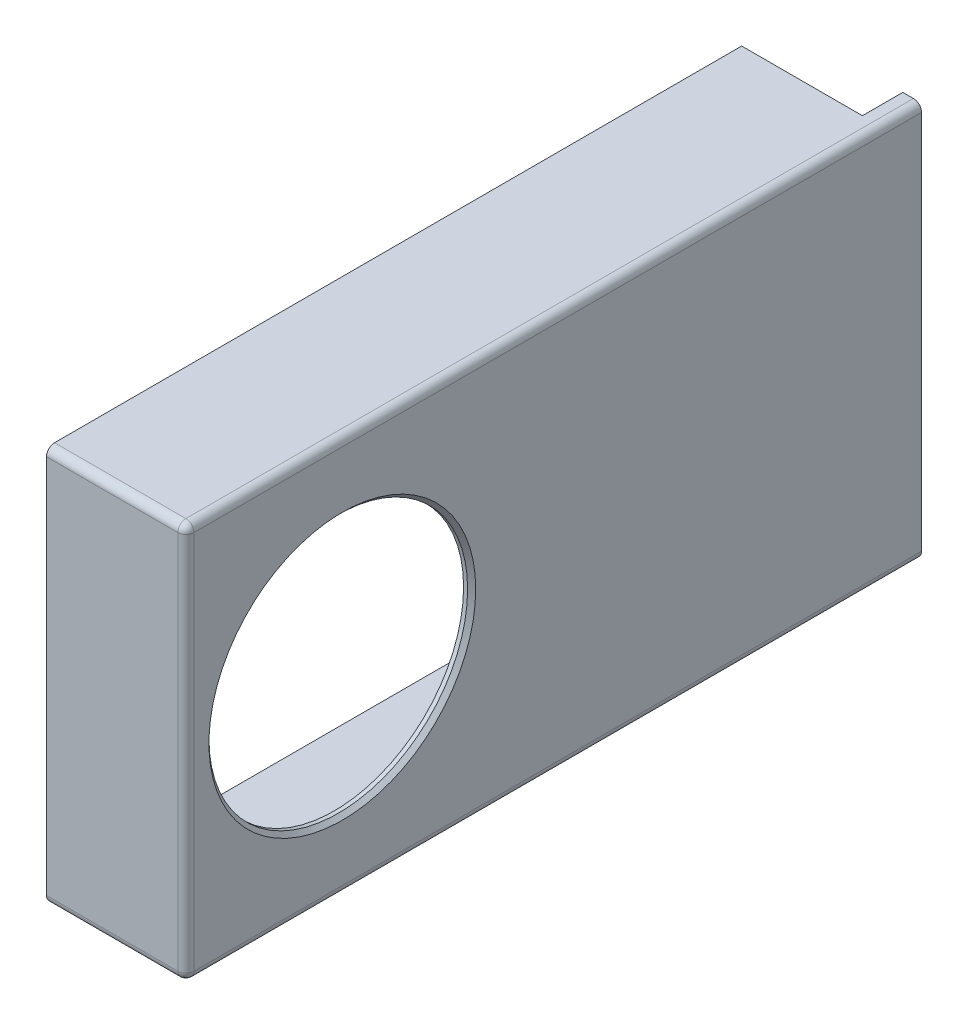
ISO-10303-21;
HEADER;
FILE_DESCRIPTION(('STEP AP214'),'2;1');
FILE_NAME('part.step','',(''),(''),'','','');
FILE_SCHEMA(('AUTOMOTIVE_DESIGN { 1 0 10303 214 1 1 1 1 }'));
ENDSEC;
DATA;
#1=APPLICATION_CONTEXT('core data for automotive mechanical design processes');
#2=APPLICATION_PROTOCOL_DEFINITION('international standard','automotive_design',2000,#1);
#3=PRODUCT_CONTEXT('',#1,'mechanical');
#4=PRODUCT('Part','Part','',(#3));
#5=PRODUCT_RELATED_PRODUCT_CATEGORY('part','',(#4));
#6=PRODUCT_DEFINITION_FORMATION('','',#4);
#7=PRODUCT_DEFINITION_CONTEXT('part definition',#1,'design');
#8=PRODUCT_DEFINITION('design','',#6,#7);
#9=PRODUCT_DEFINITION_SHAPE('','',#8);
#10=(LENGTH_UNIT() NAMED_UNIT(*) SI_UNIT(.MILLI.,.METRE.));
#11=(NAMED_UNIT(*) PLANE_ANGLE_UNIT() SI_UNIT($,.RADIAN.));
#12=(NAMED_UNIT(*) SI_UNIT($,.STERADIAN.) SOLID_ANGLE_UNIT());
#13=UNCERTAINTY_MEASURE_WITH_UNIT(LENGTH_MEASURE(1.E-05),#10,'distance_accuracy_value','');
#14=(GEOMETRIC_REPRESENTATION_CONTEXT(3) GLOBAL_UNCERTAINTY_ASSIGNED_CONTEXT((#13)) GLOBAL_UNIT_ASSIGNED_CONTEXT((#10,
#11,#12)) REPRESENTATION_CONTEXT('',''));
#15=CARTESIAN_POINT('',(0.,0.,0.));
#16=DIRECTION('',(0.,0.,1.));
#17=DIRECTION('',(1.,0.,0.));
#18=AXIS2_PLACEMENT_3D('',#15,#16,#17);
#19=CARTESIAN_POINT('',(0.,0.,0.));
#20=DIRECTION('',(1.,0.,0.));
#21=DIRECTION('',(0.,0.,-1.));
#22=AXIS2_PLACEMENT_3D('',#19,#20,#21);
#23=PLANE('',#22);
#24=DIRECTION('',(0.,0.,-1.));
#25=VECTOR('',#24,1.);
#26=CARTESIAN_POINT('',(0.,-96.,0.));
#27=LINE('',#26,#25);
#28=CARTESIAN_POINT('',(0.,-96.,-2.00000000000001));
#29=VERTEX_POINT('',#28);
#30=CARTESIAN_POINT('',(0.,-96.,-10.));
#31=VERTEX_POINT('',#30);
#32=EDGE_CURVE('E461',#29,#31,#27,.T.);
#33=ORIENTED_EDGE('',*,*,#32,.T.);
#34=DIRECTION('',(0.,-1.,0.));
#35=VECTOR('',#34,1.);
#36=CARTESIAN_POINT('',(0.,-88.,-10.));
#37=LINE('',#36,#35);
#38=CARTESIAN_POINT('',(0.,-98.,-10.));
#39=VERTEX_POINT('',#38);
#40=EDGE_CURVE('E193',#31,#39,#37,.T.);
#41=ORIENTED_EDGE('',*,*,#40,.T.);
#42=DIRECTION('',(0.,0.,-1.));
#43=VECTOR('',#42,1.);
#44=CARTESIAN_POINT('',(0.,-98.,0.));
#45=LINE('',#44,#43);
#46=CARTESIAN_POINT('',(0.,-98.,-2.00000000000001));
#47=VERTEX_POINT('',#46);
#48=EDGE_CURVE('E208',#47,#39,#45,.T.);
#49=ORIENTED_EDGE('',*,*,#48,.F.);
#50=CARTESIAN_POINT('',(0.,-96.,-2.00000000000001));
#51=DIRECTION('',(1.,0.,0.));
#52=DIRECTION('',(0.,0.,-1.));
#53=AXIS2_PLACEMENT_3D('',#50,#51,#52);
#54=CIRCLE('',#53,2.);
#55=CARTESIAN_POINT('',(0.,-96.,0.));
#56=VERTEX_POINT('',#55);
#57=EDGE_CURVE('E244',#47,#56,#54,.F.);
#58=ORIENTED_EDGE('',*,*,#57,.T.);
#59=DIRECTION('',(0.,-1.,0.));
#60=VECTOR('',#59,1.);
#61=CARTESIAN_POINT('',(0.,0.,0.));
#62=LINE('',#61,#60);
#63=CARTESIAN_POINT('',(0.,-2.,0.));
#64=VERTEX_POINT('',#63);
#65=EDGE_CURVE('E209',#64,#56,#62,.T.);
#66=ORIENTED_EDGE('',*,*,#65,.F.);
#67=CARTESIAN_POINT('',(0.,-2.,-2.));
#68=DIRECTION('',(1.,0.,0.));
#69=DIRECTION('',(0.,0.,-1.));
#70=AXIS2_PLACEMENT_3D('',#67,#68,#69);
#71=CIRCLE('',#70,2.);
#72=CARTESIAN_POINT('',(0.,0.,-2.));
#73=VERTEX_POINT('',#72);
#74=EDGE_CURVE('E246',#64,#73,#71,.F.);
#75=ORIENTED_EDGE('',*,*,#74,.T.);
#76=DIRECTION('',(0.,0.,1.));
#77=VECTOR('',#76,1.);
#78=CARTESIAN_POINT('',(0.,0.,0.));
#79=LINE('',#78,#77);
#80=CARTESIAN_POINT('',(0.,0.,-172.));
#81=VERTEX_POINT('',#80);
#82=EDGE_CURVE('E217',#81,#73,#79,.T.);
#83=ORIENTED_EDGE('',*,*,#82,.F.);
#84=DIRECTION('',(0.,1.,0.));
#85=VECTOR('',#84,1.);
#86=CARTESIAN_POINT('',(0.,0.,-172.));
#87=LINE('',#86,#85);
#88=CARTESIAN_POINT('',(0.,-2.,-172.));
#89=VERTEX_POINT('',#88);
#90=EDGE_CURVE('E414',#89,#81,#87,.T.);
#91=ORIENTED_EDGE('',*,*,#90,.F.);
#92=DIRECTION('',(0.,0.,1.));
#93=VECTOR('',#92,1.);
#94=CARTESIAN_POINT('',(0.,-2.,0.));
#95=LINE('',#94,#93);
#96=CARTESIAN_POINT('',(0.,-2.,-2.));
#97=VERTEX_POINT('',#96);
#98=EDGE_CURVE('E440',#89,#97,#95,.T.);
#99=ORIENTED_EDGE('',*,*,#98,.T.);
#100=DIRECTION('',(0.,-1.,0.));
#101=VECTOR('',#100,1.);
#102=CARTESIAN_POINT('',(0.,0.,-2.));
#103=LINE('',#102,#101);
#104=EDGE_CURVE('E229',#97,#29,#103,.T.);
#105=ORIENTED_EDGE('',*,*,#104,.T.);
#106=EDGE_LOOP('',(#33,#41,#49,#58,#66,#75,#83,#91,#99,#105));
#107=FACE_BOUND('',#106,.T.);
#108=ADVANCED_FACE('F37',(#107),#23,.F.);
#109=CARTESIAN_POINT('',(34.5,0.,0.));
#110=DIRECTION('',(0.,0.,-1.));
#111=DIRECTION('',(0.,1.,0.));
#112=AXIS2_PLACEMENT_3D('',#109,#110,#111);
#113=PLANE('',#112);
#114=DIRECTION('',(0.,-1.,0.));
#115=VECTOR('',#114,1.);
#116=CARTESIAN_POINT('',(32.5,0.,0.));
#117=LINE('',#116,#115);
#118=CARTESIAN_POINT('',(32.5,-96.,0.));
#119=VERTEX_POINT('',#118);
#120=CARTESIAN_POINT('',(32.5,-2.,0.));
#121=VERTEX_POINT('',#120);
#122=EDGE_CURVE('E237',#119,#121,#117,.F.);
#123=ORIENTED_EDGE('',*,*,#122,.T.);
#124=DIRECTION('',(-1.,0.,0.));
#125=VECTOR('',#124,1.);
#126=CARTESIAN_POINT('',(34.5,-2.,0.));
#127=LINE('',#126,#125);
#128=EDGE_CURVE('E241',#121,#64,#127,.T.);
#129=ORIENTED_EDGE('',*,*,#128,.T.);
#130=ORIENTED_EDGE('',*,*,#65,.T.);
#131=DIRECTION('',(-1.,0.,0.));
#132=VECTOR('',#131,1.);
#133=CARTESIAN_POINT('',(34.5,-96.,0.));
#134=LINE('',#133,#132);
#135=EDGE_CURVE('E239',#56,#119,#134,.F.);
#136=ORIENTED_EDGE('',*,*,#135,.T.);
#137=EDGE_LOOP('',(#123,#129,#130,#136));
#138=FACE_BOUND('',#137,.T.);
#139=ADVANCED_FACE('F323',(#138),#113,.F.);
#140=CARTESIAN_POINT('',(34.5,-98.,0.));
#141=DIRECTION('',(0.,1.,0.));
#142=DIRECTION('',(0.,0.,1.));
#143=AXIS2_PLACEMENT_3D('',#140,#141,#142);
#144=PLANE('',#143);
#145=ORIENTED_EDGE('',*,*,#48,.T.);
#146=DIRECTION('',(-1.,0.,0.));
#147=VECTOR('',#146,1.);
#148=CARTESIAN_POINT('',(0.,-98.,-10.));
#149=LINE('',#148,#147);
#150=CARTESIAN_POINT('',(14.,-98.,-10.));
#151=VERTEX_POINT('',#150);
#152=EDGE_CURVE('E194',#151,#39,#149,.T.);
#153=ORIENTED_EDGE('',*,*,#152,.F.);
#154=CARTESIAN_POINT('',(14.,-98.,-11.));
#155=DIRECTION('',(0.,1.,0.));
#156=DIRECTION('',(0.,0.,1.));
#157=AXIS2_PLACEMENT_3D('',#154,#155,#156);
#158=CIRCLE('',#157,1.);
#159=CARTESIAN_POINT('',(15.,-98.,-11.));
#160=VERTEX_POINT('',#159);
#161=EDGE_CURVE('E301',#151,#160,#158,.T.);
#162=ORIENTED_EDGE('',*,*,#161,.T.);
#163=DIRECTION('',(0.,0.,1.));
#164=VECTOR('',#163,1.);
#165=CARTESIAN_POINT('',(15.,-98.,-32.));
#166=LINE('',#165,#164);
#167=CARTESIAN_POINT('',(15.,-98.,-31.));
#168=VERTEX_POINT('',#167);
#169=EDGE_CURVE('E201',#168,#160,#166,.T.);
#170=ORIENTED_EDGE('',*,*,#169,.F.);
#171=CARTESIAN_POINT('',(14.,-98.,-31.));
#172=DIRECTION('',(0.,1.,0.));
#173=DIRECTION('',(0.,0.,1.));
#174=AXIS2_PLACEMENT_3D('',#171,#172,#173);
#175=CIRCLE('',#174,1.);
#176=CARTESIAN_POINT('',(14.,-98.,-32.));
#177=VERTEX_POINT('',#176);
#178=EDGE_CURVE('E53',#168,#177,#175,.T.);
#179=ORIENTED_EDGE('',*,*,#178,.T.);
#180=DIRECTION('',(1.,0.,0.));
#181=VECTOR('',#180,1.);
#182=CARTESIAN_POINT('',(0.,-98.,-32.));
#183=LINE('',#182,#181);
#184=CARTESIAN_POINT('',(0.,-98.,-32.));
#185=VERTEX_POINT('',#184);
#186=EDGE_CURVE('E188',#185,#177,#183,.T.);
#187=ORIENTED_EDGE('',*,*,#186,.F.);
#188=CARTESIAN_POINT('',(0.,-98.,-182.));
#189=VERTEX_POINT('',#188);
#190=EDGE_CURVE('E199',#185,#189,#45,.T.);
#191=ORIENTED_EDGE('',*,*,#190,.T.);
#192=DIRECTION('',(-1.,0.,0.));
#193=VECTOR('',#192,1.);
#194=CARTESIAN_POINT('',(34.5,-98.,-182.));
#195=LINE('',#194,#193);
#196=CARTESIAN_POINT('',(32.5,-98.,-182.));
#197=VERTEX_POINT('',#196);
#198=EDGE_CURVE('E223',#197,#189,#195,.T.);
#199=ORIENTED_EDGE('',*,*,#198,.F.);
#200=DIRECTION('',(0.,0.,-1.));
#201=VECTOR('',#200,1.);
#202=CARTESIAN_POINT('',(32.5,-98.,0.));
#203=LINE('',#202,#201);
#204=CARTESIAN_POINT('',(32.5,-98.,-2.00000000000001));
#205=VERTEX_POINT('',#204);
#206=EDGE_CURVE('E252',#197,#205,#203,.F.);
#207=ORIENTED_EDGE('',*,*,#206,.T.);
#208=DIRECTION('',(-1.,0.,0.));
#209=VECTOR('',#208,1.);
#210=CARTESIAN_POINT('',(34.5,-98.,-2.00000000000001));
#211=LINE('',#210,#209);
#212=EDGE_CURVE('E254',#205,#47,#211,.T.);
#213=ORIENTED_EDGE('',*,*,#212,.T.);
#214=EDGE_LOOP('',(#145,#153,#162,#170,#179,#187,#191,#199,#207,#213));
#215=FACE_BOUND('',#214,.T.);
#216=ADVANCED_FACE('F197',(#215),#144,.F.);
#217=CARTESIAN_POINT('',(34.5,0.,-182.));
#218=DIRECTION('',(0.,0.,1.));
#219=DIRECTION('',(1.,0.,0.));
#220=AXIS2_PLACEMENT_3D('',#217,#218,#219);
#221=PLANE('',#220);
#222=DIRECTION('',(-1.,0.,0.));
#223=VECTOR('',#222,1.);
#224=CARTESIAN_POINT('',(34.5,0.,-182.));
#225=LINE('',#224,#223);
#226=CARTESIAN_POINT('',(32.5,0.,-182.));
#227=VERTEX_POINT('',#226);
#228=CARTESIAN_POINT('',(29.8664505266402,0.,-182.));
#229=VERTEX_POINT('',#228);
#230=EDGE_CURVE('E221',#227,#229,#225,.T.);
#231=ORIENTED_EDGE('',*,*,#230,.F.);
#232=CARTESIAN_POINT('',(32.5,-2.,-182.));
#233=DIRECTION('',(0.,0.,1.));
#234=DIRECTION('',(1.,0.,0.));
#235=AXIS2_PLACEMENT_3D('',#232,#233,#234);
#236=CIRCLE('',#235,2.);
#237=CARTESIAN_POINT('',(34.5,-2.,-182.));
#238=VERTEX_POINT('',#237);
#239=EDGE_CURVE('E264',#227,#238,#236,.F.);
#240=ORIENTED_EDGE('',*,*,#239,.T.);
#241=DIRECTION('',(0.,1.,0.));
#242=VECTOR('',#241,1.);
#243=CARTESIAN_POINT('',(34.5,0.,-182.));
#244=LINE('',#243,#242);
#245=CARTESIAN_POINT('',(34.5,-96.,-182.));
#246=VERTEX_POINT('',#245);
#247=EDGE_CURVE('E220',#246,#238,#244,.T.);
#248=ORIENTED_EDGE('',*,*,#247,.F.);
#249=CARTESIAN_POINT('',(32.5,-96.,-182.));
#250=DIRECTION('',(0.,0.,1.));
#251=DIRECTION('',(1.,0.,0.));
#252=AXIS2_PLACEMENT_3D('',#249,#250,#251);
#253=CIRCLE('',#252,2.);
#254=EDGE_CURVE('E262',#246,#197,#253,.F.);
#255=ORIENTED_EDGE('',*,*,#254,.T.);
#256=ORIENTED_EDGE('',*,*,#198,.T.);
#257=DIRECTION('',(0.,1.,0.));
#258=VECTOR('',#257,1.);
#259=CARTESIAN_POINT('',(0.,0.,-182.));
#260=LINE('',#259,#258);
#261=CARTESIAN_POINT('',(0.,-86.6752894881628,-182.));
#262=VERTEX_POINT('',#261);
#263=EDGE_CURVE('E207',#189,#262,#260,.T.);
#264=ORIENTED_EDGE('',*,*,#263,.T.);
#265=DIRECTION('',(-1.,0.,0.));
#266=VECTOR('',#265,1.);
#267=CARTESIAN_POINT('',(0.,-86.6752894881628,-182.));
#268=LINE('',#267,#266);
#269=CARTESIAN_POINT('',(29.8664505266402,-86.6752894881628,-182.));
#270=VERTEX_POINT('',#269);
#271=EDGE_CURVE('E417',#270,#262,#268,.T.);
#272=ORIENTED_EDGE('',*,*,#271,.F.);
#273=DIRECTION('',(0.,-1.,0.));
#274=VECTOR('',#273,1.);
#275=CARTESIAN_POINT('',(29.8664505266402,0.,-182.));
#276=LINE('',#275,#274);
#277=EDGE_CURVE('E284',#229,#270,#276,.T.);
#278=ORIENTED_EDGE('',*,*,#277,.F.);
#279=EDGE_LOOP('',(#231,#240,#248,#255,#256,#264,#272,#278));
#280=FACE_BOUND('',#279,.T.);
#281=ADVANCED_FACE('F351',(#280),#221,.F.);
#282=CARTESIAN_POINT('',(34.5,0.,0.));
#283=DIRECTION('',(0.,-1.,0.));
#284=DIRECTION('',(0.,0.,-1.));
#285=AXIS2_PLACEMENT_3D('',#282,#283,#284);
#286=PLANE('',#285);
#287=ORIENTED_EDGE('',*,*,#82,.T.);
#288=DIRECTION('',(-1.,0.,0.));
#289=VECTOR('',#288,1.);
#290=CARTESIAN_POINT('',(34.5,0.,-2.));
#291=LINE('',#290,#289);
#292=CARTESIAN_POINT('',(32.5,0.,-2.));
#293=VERTEX_POINT('',#292);
#294=EDGE_CURVE('E250',#73,#293,#291,.F.);
#295=ORIENTED_EDGE('',*,*,#294,.T.);
#296=DIRECTION('',(0.,0.,1.));
#297=VECTOR('',#296,1.);
#298=CARTESIAN_POINT('',(32.5,0.,-182.));
#299=LINE('',#298,#297);
#300=EDGE_CURVE('E248',#293,#227,#299,.F.);
#301=ORIENTED_EDGE('',*,*,#300,.T.);
#302=ORIENTED_EDGE('',*,*,#230,.T.);
#303=DIRECTION('',(0.,0.,-1.));
#304=VECTOR('',#303,1.);
#305=CARTESIAN_POINT('',(29.8664505266402,0.,-172.));
#306=LINE('',#305,#304);
#307=CARTESIAN_POINT('',(29.8664505266402,0.,-172.));
#308=VERTEX_POINT('',#307);
#309=EDGE_CURVE('E422',#308,#229,#306,.T.);
#310=ORIENTED_EDGE('',*,*,#309,.F.);
#311=DIRECTION('',(1.,0.,0.));
#312=VECTOR('',#311,1.);
#313=CARTESIAN_POINT('',(0.,0.,-172.));
#314=LINE('',#313,#312);
#315=EDGE_CURVE('E416',#81,#308,#314,.T.);
#316=ORIENTED_EDGE('',*,*,#315,.F.);
#317=EDGE_LOOP('',(#287,#295,#301,#302,#310,#316));
#318=FACE_BOUND('',#317,.T.);
#319=ADVANCED_FACE('F345',(#318),#286,.F.);
#320=CARTESIAN_POINT('',(34.5,0.,0.));
#321=DIRECTION('',(1.,0.,0.));
#322=DIRECTION('',(0.,0.,-1.));
#323=AXIS2_PLACEMENT_3D('',#320,#321,#322);
#324=PLANE('',#323);
#325=CARTESIAN_POINT('',(34.5,-49.,-38.6986046645568));
#326=DIRECTION('',(1.,0.,0.));
#327=DIRECTION('',(0.,0.,-1.));
#328=AXIS2_PLACEMENT_3D('',#325,#326,#327);
#329=CIRCLE('',#328,33.);
#330=CARTESIAN_POINT('',(34.5,-49.,-71.6986046645568));
#331=VERTEX_POINT('',#330);
#332=EDGE_CURVE('E11',#331,#331,#329,.F.);
#333=ORIENTED_EDGE('',*,*,#332,.T.);
#334=EDGE_LOOP('',(#333));
#335=FACE_BOUND('',#334,.T.);
#336=ORIENTED_EDGE('',*,*,#247,.T.);
#337=DIRECTION('',(0.,0.,1.));
#338=VECTOR('',#337,1.);
#339=CARTESIAN_POINT('',(34.5,-2.,0.));
#340=LINE('',#339,#338);
#341=CARTESIAN_POINT('',(34.5,-2.,-2.));
#342=VERTEX_POINT('',#341);
#343=EDGE_CURVE('E260',#238,#342,#340,.T.);
#344=ORIENTED_EDGE('',*,*,#343,.T.);
#345=DIRECTION('',(0.,-1.,0.));
#346=VECTOR('',#345,1.);
#347=CARTESIAN_POINT('',(34.5,-98.,-2.00000000000001));
#348=LINE('',#347,#346);
#349=CARTESIAN_POINT('',(34.5,-96.,-2.00000000000001));
#350=VERTEX_POINT('',#349);
#351=EDGE_CURVE('E258',#342,#350,#348,.T.);
#352=ORIENTED_EDGE('',*,*,#351,.T.);
#353=DIRECTION('',(0.,0.,-1.));
#354=VECTOR('',#353,1.);
#355=CARTESIAN_POINT('',(34.5,-96.,-182.));
#356=LINE('',#355,#354);
#357=EDGE_CURVE('E256',#350,#246,#356,.T.);
#358=ORIENTED_EDGE('',*,*,#357,.T.);
#359=EDGE_LOOP('',(#336,#344,#352,#358));
#360=FACE_BOUND('',#359,.T.);
#361=ADVANCED_FACE('F336',(#335,#360),#324,.T.);
#362=ORIENTED_EDGE('',*,*,#190,.F.);
#363=DIRECTION('',(0.,-1.,0.));
#364=VECTOR('',#363,1.);
#365=CARTESIAN_POINT('',(0.,-88.,-32.));
#366=LINE('',#365,#364);
#367=CARTESIAN_POINT('',(0.,-96.,-32.));
#368=VERTEX_POINT('',#367);
#369=EDGE_CURVE('E186',#368,#185,#366,.T.);
#370=ORIENTED_EDGE('',*,*,#369,.F.);
#371=CARTESIAN_POINT('',(0.,-96.,-180.));
#372=VERTEX_POINT('',#371);
#373=EDGE_CURVE('E456',#368,#372,#27,.T.);
#374=ORIENTED_EDGE('',*,*,#373,.T.);
#375=DIRECTION('',(0.,1.,0.));
#376=VECTOR('',#375,1.);
#377=CARTESIAN_POINT('',(0.,0.,-180.));
#378=LINE('',#377,#376);
#379=CARTESIAN_POINT('',(0.,-86.6752894881628,-180.));
#380=VERTEX_POINT('',#379);
#381=EDGE_CURVE('E458',#372,#380,#378,.T.);
#382=ORIENTED_EDGE('',*,*,#381,.T.);
#383=DIRECTION('',(0.,0.,-1.));
#384=VECTOR('',#383,1.);
#385=CARTESIAN_POINT('',(0.,-86.6752894881628,-172.));
#386=LINE('',#385,#384);
#387=EDGE_CURVE('E426',#380,#262,#386,.T.);
#388=ORIENTED_EDGE('',*,*,#387,.T.);
#389=ORIENTED_EDGE('',*,*,#263,.F.);
#390=EDGE_LOOP('',(#362,#370,#374,#382,#388,#389));
#391=FACE_BOUND('',#390,.T.);
#392=ADVANCED_FACE('F204',(#391),#23,.F.);
#393=CARTESIAN_POINT('',(34.5,0.,-2.));
#394=DIRECTION('',(0.,0.,-1.));
#395=DIRECTION('',(0.,1.,0.));
#396=AXIS2_PLACEMENT_3D('',#393,#394,#395);
#397=PLANE('',#396);
#398=ORIENTED_EDGE('',*,*,#104,.F.);
#399=DIRECTION('',(-1.,0.,0.));
#400=VECTOR('',#399,1.);
#401=CARTESIAN_POINT('',(34.5,-2.,-2.));
#402=LINE('',#401,#400);
#403=CARTESIAN_POINT('',(32.5,-2.,-2.));
#404=VERTEX_POINT('',#403);
#405=EDGE_CURVE('E441',#404,#97,#402,.T.);
#406=ORIENTED_EDGE('',*,*,#405,.F.);
#407=DIRECTION('',(0.,-1.,0.));
#408=VECTOR('',#407,1.);
#409=CARTESIAN_POINT('',(32.5,0.,-2.));
#410=LINE('',#409,#408);
#411=CARTESIAN_POINT('',(32.5,-96.,-2.00000000000001));
#412=VERTEX_POINT('',#411);
#413=EDGE_CURVE('E436',#404,#412,#410,.T.);
#414=ORIENTED_EDGE('',*,*,#413,.T.);
#415=DIRECTION('',(-1.,0.,0.));
#416=VECTOR('',#415,1.);
#417=CARTESIAN_POINT('',(34.5,-96.,-2.00000000000001));
#418=LINE('',#417,#416);
#419=EDGE_CURVE('E212',#412,#29,#418,.T.);
#420=ORIENTED_EDGE('',*,*,#419,.T.);
#421=EDGE_LOOP('',(#398,#406,#414,#420));
#422=FACE_BOUND('',#421,.T.);
#423=ADVANCED_FACE('F335',(#422),#397,.T.);
#424=CARTESIAN_POINT('',(34.5,-96.,0.));
#425=DIRECTION('',(0.,1.,0.));
#426=DIRECTION('',(0.,0.,1.));
#427=AXIS2_PLACEMENT_3D('',#424,#425,#426);
#428=PLANE('',#427);
#429=DIRECTION('',(1.,0.,0.));
#430=VECTOR('',#429,1.);
#431=CARTESIAN_POINT('',(34.5,-96.,-10.));
#432=LINE('',#431,#430);
#433=CARTESIAN_POINT('',(14.,-96.,-10.));
#434=VERTEX_POINT('',#433);
#435=EDGE_CURVE('E289',#31,#434,#432,.T.);
#436=ORIENTED_EDGE('',*,*,#435,.F.);
#437=ORIENTED_EDGE('',*,*,#32,.F.);
#438=ORIENTED_EDGE('',*,*,#419,.F.);
#439=DIRECTION('',(0.,0.,-1.));
#440=VECTOR('',#439,1.);
#441=CARTESIAN_POINT('',(32.5,-96.,0.));
#442=LINE('',#441,#440);
#443=CARTESIAN_POINT('',(32.5,-96.,-180.));
#444=VERTEX_POINT('',#443);
#445=EDGE_CURVE('E439',#412,#444,#442,.T.);
#446=ORIENTED_EDGE('',*,*,#445,.T.);
#447=DIRECTION('',(-1.,0.,0.));
#448=VECTOR('',#447,1.);
#449=CARTESIAN_POINT('',(34.5,-96.,-180.));
#450=LINE('',#449,#448);
#451=EDGE_CURVE('E435',#444,#372,#450,.T.);
#452=ORIENTED_EDGE('',*,*,#451,.T.);
#453=ORIENTED_EDGE('',*,*,#373,.F.);
#454=DIRECTION('',(-1.,0.,0.));
#455=VECTOR('',#454,1.);
#456=CARTESIAN_POINT('',(34.5,-96.,-32.));
#457=LINE('',#456,#455);
#458=CARTESIAN_POINT('',(14.,-96.,-32.));
#459=VERTEX_POINT('',#458);
#460=EDGE_CURVE('E189',#459,#368,#457,.T.);
#461=ORIENTED_EDGE('',*,*,#460,.F.);
#462=CARTESIAN_POINT('',(14.,-96.,-31.));
#463=DIRECTION('',(0.,1.,0.));
#464=DIRECTION('',(0.,0.,1.));
#465=AXIS2_PLACEMENT_3D('',#462,#463,#464);
#466=CIRCLE('',#465,1.);
#467=CARTESIAN_POINT('',(15.,-96.,-31.));
#468=VERTEX_POINT('',#467);
#469=EDGE_CURVE('E306',#459,#468,#466,.F.);
#470=ORIENTED_EDGE('',*,*,#469,.T.);
#471=DIRECTION('',(0.,0.,-1.));
#472=VECTOR('',#471,1.);
#473=CARTESIAN_POINT('',(15.,-96.,0.));
#474=LINE('',#473,#472);
#475=CARTESIAN_POINT('',(15.,-96.,-11.));
#476=VERTEX_POINT('',#475);
#477=EDGE_CURVE('E286',#476,#468,#474,.T.);
#478=ORIENTED_EDGE('',*,*,#477,.F.);
#479=CARTESIAN_POINT('',(14.,-96.,-11.));
#480=DIRECTION('',(0.,1.,0.));
#481=DIRECTION('',(0.,0.,1.));
#482=AXIS2_PLACEMENT_3D('',#479,#480,#481);
#483=CIRCLE('',#482,1.);
#484=EDGE_CURVE('E303',#476,#434,#483,.F.);
#485=ORIENTED_EDGE('',*,*,#484,.T.);
#486=EDGE_LOOP('',(#436,#437,#438,#446,#452,#453,#461,#470,#478,#485));
#487=FACE_BOUND('',#486,.T.);
#488=ADVANCED_FACE('F341',(#487),#428,.T.);
#489=CARTESIAN_POINT('',(34.5,0.,-180.));
#490=DIRECTION('',(0.,0.,1.));
#491=DIRECTION('',(1.,0.,0.));
#492=AXIS2_PLACEMENT_3D('',#489,#490,#491);
#493=PLANE('',#492);
#494=DIRECTION('',(1.,0.,0.));
#495=VECTOR('',#494,1.);
#496=CARTESIAN_POINT('',(34.5,-86.6752894881628,-180.));
#497=LINE('',#496,#495);
#498=CARTESIAN_POINT('',(29.8664505266402,-86.6752894881628,-180.));
#499=VERTEX_POINT('',#498);
#500=EDGE_CURVE('E235',#380,#499,#497,.T.);
#501=ORIENTED_EDGE('',*,*,#500,.F.);
#502=ORIENTED_EDGE('',*,*,#381,.F.);
#503=ORIENTED_EDGE('',*,*,#451,.F.);
#504=DIRECTION('',(0.,1.,0.));
#505=VECTOR('',#504,1.);
#506=CARTESIAN_POINT('',(32.5,0.,-180.));
#507=LINE('',#506,#505);
#508=CARTESIAN_POINT('',(32.5,-2.,-180.));
#509=VERTEX_POINT('',#508);
#510=EDGE_CURVE('E449',#444,#509,#507,.T.);
#511=ORIENTED_EDGE('',*,*,#510,.T.);
#512=DIRECTION('',(-1.,0.,0.));
#513=VECTOR('',#512,1.);
#514=CARTESIAN_POINT('',(34.5,-2.,-180.));
#515=LINE('',#514,#513);
#516=CARTESIAN_POINT('',(29.8664505266402,-2.,-180.));
#517=VERTEX_POINT('',#516);
#518=EDGE_CURVE('E444',#509,#517,#515,.T.);
#519=ORIENTED_EDGE('',*,*,#518,.T.);
#520=DIRECTION('',(0.,1.,0.));
#521=VECTOR('',#520,1.);
#522=CARTESIAN_POINT('',(29.8664505266402,0.,-180.));
#523=LINE('',#522,#521);
#524=EDGE_CURVE('E230',#499,#517,#523,.T.);
#525=ORIENTED_EDGE('',*,*,#524,.F.);
#526=EDGE_LOOP('',(#501,#502,#503,#511,#519,#525));
#527=FACE_BOUND('',#526,.T.);
#528=ADVANCED_FACE('F362',(#527),#493,.T.);
#529=CARTESIAN_POINT('',(34.5,-2.,0.));
#530=DIRECTION('',(0.,-1.,0.));
#531=DIRECTION('',(0.,0.,-1.));
#532=AXIS2_PLACEMENT_3D('',#529,#530,#531);
#533=PLANE('',#532);
#534=DIRECTION('',(0.,0.,1.));
#535=VECTOR('',#534,1.);
#536=CARTESIAN_POINT('',(29.8664505266402,-2.,0.));
#537=LINE('',#536,#535);
#538=CARTESIAN_POINT('',(29.8664505266402,-2.,-172.));
#539=VERTEX_POINT('',#538);
#540=EDGE_CURVE('E232',#517,#539,#537,.T.);
#541=ORIENTED_EDGE('',*,*,#540,.F.);
#542=ORIENTED_EDGE('',*,*,#518,.F.);
#543=DIRECTION('',(0.,0.,1.));
#544=VECTOR('',#543,1.);
#545=CARTESIAN_POINT('',(32.5,-2.,0.));
#546=LINE('',#545,#544);
#547=EDGE_CURVE('E445',#509,#404,#546,.T.);
#548=ORIENTED_EDGE('',*,*,#547,.T.);
#549=ORIENTED_EDGE('',*,*,#405,.T.);
#550=ORIENTED_EDGE('',*,*,#98,.F.);
#551=DIRECTION('',(-1.,0.,0.));
#552=VECTOR('',#551,1.);
#553=CARTESIAN_POINT('',(34.5,-2.,-172.));
#554=LINE('',#553,#552);
#555=EDGE_CURVE('E225',#539,#89,#554,.T.);
#556=ORIENTED_EDGE('',*,*,#555,.F.);
#557=EDGE_LOOP('',(#541,#542,#548,#549,#550,#556));
#558=FACE_BOUND('',#557,.T.);
#559=ADVANCED_FACE('F358',(#558),#533,.T.);
#560=CARTESIAN_POINT('',(32.5,0.,0.));
#561=DIRECTION('',(1.,0.,0.));
#562=DIRECTION('',(0.,0.,-1.));
#563=AXIS2_PLACEMENT_3D('',#560,#561,#562);
#564=PLANE('',#563);
#565=CARTESIAN_POINT('',(32.5,-49.,-38.6986046645568));
#566=DIRECTION('',(1.,0.,0.));
#567=DIRECTION('',(0.,0.,-1.));
#568=AXIS2_PLACEMENT_3D('',#565,#566,#567);
#569=CIRCLE('',#568,32.);
#570=CARTESIAN_POINT('',(32.5,-49.,-70.6986046645568));
#571=VERTEX_POINT('',#570);
#572=EDGE_CURVE('E226',#571,#571,#569,.T.);
#573=ORIENTED_EDGE('',*,*,#572,.T.);
#574=EDGE_LOOP('',(#573));
#575=FACE_BOUND('',#574,.T.);
#576=ORIENTED_EDGE('',*,*,#413,.F.);
#577=ORIENTED_EDGE('',*,*,#547,.F.);
#578=ORIENTED_EDGE('',*,*,#510,.F.);
#579=ORIENTED_EDGE('',*,*,#445,.F.);
#580=EDGE_LOOP('',(#576,#577,#578,#579));
#581=FACE_BOUND('',#580,.T.);
#582=ADVANCED_FACE('F355',(#575,#581),#564,.F.);
#583=CARTESIAN_POINT('',(24.5,-49.,-38.6986046645568));
#584=DIRECTION('',(1.,0.,0.));
#585=DIRECTION('',(0.,0.,-1.));
#586=AXIS2_PLACEMENT_3D('',#583,#584,#585);
#587=CYLINDRICAL_SURFACE('',#586,32.);
#588=CARTESIAN_POINT('',(33.5,-49.,-38.6986046645568));
#589=DIRECTION('',(1.,0.,0.));
#590=DIRECTION('',(0.,0.,-1.));
#591=AXIS2_PLACEMENT_3D('',#588,#589,#590);
#592=CIRCLE('',#591,32.);
#593=CARTESIAN_POINT('',(33.5,-49.,-70.6986046645568));
#594=VERTEX_POINT('',#593);
#595=EDGE_CURVE('E46',#594,#594,#592,.T.);
#596=ORIENTED_EDGE('',*,*,#595,.T.);
#597=EDGE_LOOP('',(#596));
#598=FACE_BOUND('',#597,.T.);
#599=ORIENTED_EDGE('',*,*,#572,.F.);
#600=EDGE_LOOP('',(#599));
#601=FACE_BOUND('',#600,.T.);
#602=ADVANCED_FACE('F310',(#598,#601),#587,.F.);
#603=CARTESIAN_POINT('',(0.,-86.6752894881628,-172.));
#604=DIRECTION('',(0.,-1.,0.));
#605=DIRECTION('',(0.,0.,-1.));
#606=AXIS2_PLACEMENT_3D('',#603,#604,#605);
#607=PLANE('',#606);
#608=ORIENTED_EDGE('',*,*,#500,.T.);
#609=DIRECTION('',(0.,0.,-1.));
#610=VECTOR('',#609,1.);
#611=CARTESIAN_POINT('',(29.8664505266402,-86.6752894881628,-172.));
#612=LINE('',#611,#610);
#613=EDGE_CURVE('E428',#499,#270,#612,.T.);
#614=ORIENTED_EDGE('',*,*,#613,.T.);
#615=ORIENTED_EDGE('',*,*,#271,.T.);
#616=ORIENTED_EDGE('',*,*,#387,.F.);
#617=EDGE_LOOP('',(#608,#614,#615,#616));
#618=FACE_BOUND('',#617,.T.);
#619=ADVANCED_FACE('F371',(#618),#607,.F.);
#620=CARTESIAN_POINT('',(29.8664505266402,0.,-172.));
#621=DIRECTION('',(1.,0.,0.));
#622=DIRECTION('',(0.,0.,-1.));
#623=AXIS2_PLACEMENT_3D('',#620,#621,#622);
#624=PLANE('',#623);
#625=ORIENTED_EDGE('',*,*,#524,.T.);
#626=ORIENTED_EDGE('',*,*,#540,.T.);
#627=DIRECTION('',(0.,-1.,0.));
#628=VECTOR('',#627,1.);
#629=CARTESIAN_POINT('',(29.8664505266402,0.,-172.));
#630=LINE('',#629,#628);
#631=EDGE_CURVE('E420',#308,#539,#630,.T.);
#632=ORIENTED_EDGE('',*,*,#631,.F.);
#633=ORIENTED_EDGE('',*,*,#309,.T.);
#634=ORIENTED_EDGE('',*,*,#277,.T.);
#635=ORIENTED_EDGE('',*,*,#613,.F.);
#636=EDGE_LOOP('',(#625,#626,#632,#633,#634,#635));
#637=FACE_BOUND('',#636,.T.);
#638=ADVANCED_FACE('F372',(#637),#624,.F.);
#639=CARTESIAN_POINT('',(0.,0.,-172.));
#640=DIRECTION('',(0.,0.,1.));
#641=DIRECTION('',(1.,0.,0.));
#642=AXIS2_PLACEMENT_3D('',#639,#640,#641);
#643=PLANE('',#642);
#644=ORIENTED_EDGE('',*,*,#555,.T.);
#645=ORIENTED_EDGE('',*,*,#90,.T.);
#646=ORIENTED_EDGE('',*,*,#315,.T.);
#647=ORIENTED_EDGE('',*,*,#631,.T.);
#648=EDGE_LOOP('',(#644,#645,#646,#647));
#649=FACE_BOUND('',#648,.T.);
#650=ADVANCED_FACE('F375',(#649),#643,.F.);
#651=CARTESIAN_POINT('',(32.5,-96.,0.));
#652=DIRECTION('',(0.,0.,1.));
#653=DIRECTION('',(1.,0.,0.));
#654=AXIS2_PLACEMENT_3D('',#651,#652,#653);
#655=CYLINDRICAL_SURFACE('',#654,2.);
#656=ORIENTED_EDGE('',*,*,#254,.F.);
#657=ORIENTED_EDGE('',*,*,#357,.F.);
#658=CARTESIAN_POINT('',(32.5,-96.,-2.00000000000001));
#659=DIRECTION('',(0.,0.,1.));
#660=DIRECTION('',(1.,0.,0.));
#661=AXIS2_PLACEMENT_3D('',#658,#659,#660);
#662=CIRCLE('',#661,2.);
#663=EDGE_CURVE('E281',#205,#350,#662,.T.);
#664=ORIENTED_EDGE('',*,*,#663,.F.);
#665=ORIENTED_EDGE('',*,*,#206,.F.);
#666=EDGE_LOOP('',(#656,#657,#664,#665));
#667=FACE_BOUND('',#666,.T.);
#668=ADVANCED_FACE('F382',(#667),#655,.T.);
#669=CARTESIAN_POINT('',(34.5,-96.,-2.00000000000001));
#670=DIRECTION('',(-1.,0.,0.));
#671=DIRECTION('',(0.,0.,1.));
#672=AXIS2_PLACEMENT_3D('',#669,#670,#671);
#673=CYLINDRICAL_SURFACE('',#672,2.);
#674=ORIENTED_EDGE('',*,*,#57,.F.);
#675=ORIENTED_EDGE('',*,*,#212,.F.);
#676=CARTESIAN_POINT('',(32.5,-96.,-2.00000000000001));
#677=DIRECTION('',(1.,0.,0.));
#678=DIRECTION('',(0.,0.,-1.));
#679=AXIS2_PLACEMENT_3D('',#676,#677,#678);
#680=CIRCLE('',#679,2.);
#681=EDGE_CURVE('E278',#119,#205,#680,.T.);
#682=ORIENTED_EDGE('',*,*,#681,.F.);
#683=ORIENTED_EDGE('',*,*,#135,.F.);
#684=EDGE_LOOP('',(#674,#675,#682,#683));
#685=FACE_BOUND('',#684,.T.);
#686=ADVANCED_FACE('F492',(#685),#673,.T.);
#687=CARTESIAN_POINT('',(32.5,-96.,-2.00000000000001));
#688=DIRECTION('',(0.,0.,1.));
#689=DIRECTION('',(1.,0.,0.));
#690=AXIS2_PLACEMENT_3D('',#687,#688,#689);
#691=SPHERICAL_SURFACE('',#690,2.);
#692=ORIENTED_EDGE('',*,*,#681,.T.);
#693=ORIENTED_EDGE('',*,*,#663,.T.);
#694=CARTESIAN_POINT('',(32.5,-96.,-2.00000000000001));
#695=DIRECTION('',(0.,-1.,0.));
#696=DIRECTION('',(0.,0.,-1.));
#697=AXIS2_PLACEMENT_3D('',#694,#695,#696);
#698=CIRCLE('',#697,2.);
#699=EDGE_CURVE('E275',#119,#350,#698,.F.);
#700=ORIENTED_EDGE('',*,*,#699,.F.);
#701=EDGE_LOOP('',(#692,#693,#700));
#702=FACE_BOUND('',#701,.T.);
#703=ADVANCED_FACE('F486',(#702),#691,.T.);
#704=CARTESIAN_POINT('',(32.5,-2.,0.));
#705=DIRECTION('',(0.,0.,-1.));
#706=DIRECTION('',(-1.,0.,0.));
#707=AXIS2_PLACEMENT_3D('',#704,#705,#706);
#708=CYLINDRICAL_SURFACE('',#707,2.);
#709=ORIENTED_EDGE('',*,*,#239,.F.);
#710=ORIENTED_EDGE('',*,*,#300,.F.);
#711=CARTESIAN_POINT('',(32.5,-2.,-2.));
#712=DIRECTION('',(0.,0.,1.));
#713=DIRECTION('',(1.,0.,0.));
#714=AXIS2_PLACEMENT_3D('',#711,#712,#713);
#715=CIRCLE('',#714,2.);
#716=EDGE_CURVE('E272',#342,#293,#715,.T.);
#717=ORIENTED_EDGE('',*,*,#716,.F.);
#718=ORIENTED_EDGE('',*,*,#343,.F.);
#719=EDGE_LOOP('',(#709,#710,#717,#718));
#720=FACE_BOUND('',#719,.T.);
#721=ADVANCED_FACE('F472',(#720),#708,.T.);
#722=CARTESIAN_POINT('',(32.5,0.,-2.));
#723=DIRECTION('',(0.,1.,0.));
#724=DIRECTION('',(0.,0.,1.));
#725=AXIS2_PLACEMENT_3D('',#722,#723,#724);
#726=CYLINDRICAL_SURFACE('',#725,2.);
#727=ORIENTED_EDGE('',*,*,#699,.T.);
#728=ORIENTED_EDGE('',*,*,#351,.F.);
#729=CARTESIAN_POINT('',(32.5,-2.,-2.));
#730=DIRECTION('',(0.,1.,0.));
#731=DIRECTION('',(0.,0.,1.));
#732=AXIS2_PLACEMENT_3D('',#729,#730,#731);
#733=CIRCLE('',#732,2.);
#734=EDGE_CURVE('E269',#121,#342,#733,.T.);
#735=ORIENTED_EDGE('',*,*,#734,.F.);
#736=ORIENTED_EDGE('',*,*,#122,.F.);
#737=EDGE_LOOP('',(#727,#728,#735,#736));
#738=FACE_BOUND('',#737,.T.);
#739=ADVANCED_FACE('F480',(#738),#726,.T.);
#740=CARTESIAN_POINT('',(32.5,-2.,-2.));
#741=DIRECTION('',(0.,0.,1.));
#742=DIRECTION('',(1.,0.,0.));
#743=AXIS2_PLACEMENT_3D('',#740,#741,#742);
#744=SPHERICAL_SURFACE('',#743,2.);
#745=ORIENTED_EDGE('',*,*,#734,.T.);
#746=ORIENTED_EDGE('',*,*,#716,.T.);
#747=CARTESIAN_POINT('',(32.5,-2.,-2.));
#748=DIRECTION('',(1.,0.,0.));
#749=DIRECTION('',(0.,0.,-1.));
#750=AXIS2_PLACEMENT_3D('',#747,#748,#749);
#751=CIRCLE('',#750,2.);
#752=EDGE_CURVE('E266',#121,#293,#751,.F.);
#753=ORIENTED_EDGE('',*,*,#752,.F.);
#754=EDGE_LOOP('',(#745,#746,#753));
#755=FACE_BOUND('',#754,.T.);
#756=ADVANCED_FACE('F397',(#755),#744,.T.);
#757=CARTESIAN_POINT('',(34.5,-2.,-2.));
#758=DIRECTION('',(-1.,0.,0.));
#759=DIRECTION('',(0.,0.,1.));
#760=AXIS2_PLACEMENT_3D('',#757,#758,#759);
#761=CYLINDRICAL_SURFACE('',#760,2.);
#762=ORIENTED_EDGE('',*,*,#752,.T.);
#763=ORIENTED_EDGE('',*,*,#294,.F.);
#764=ORIENTED_EDGE('',*,*,#74,.F.);
#765=ORIENTED_EDGE('',*,*,#128,.F.);
#766=EDGE_LOOP('',(#762,#763,#764,#765));
#767=FACE_BOUND('',#766,.T.);
#768=ADVANCED_FACE('F392',(#767),#761,.T.);
#769=CARTESIAN_POINT('',(0.,-88.,-10.));
#770=DIRECTION('',(0.,0.,1.));
#771=DIRECTION('',(1.,0.,0.));
#772=AXIS2_PLACEMENT_3D('',#769,#770,#771);
#773=PLANE('',#772);
#774=ORIENTED_EDGE('',*,*,#435,.T.);
#775=DIRECTION('',(0.,-1.,0.));
#776=VECTOR('',#775,1.);
#777=CARTESIAN_POINT('',(14.,-98.,-10.));
#778=LINE('',#777,#776);
#779=EDGE_CURVE('E292',#434,#151,#778,.T.);
#780=ORIENTED_EDGE('',*,*,#779,.T.);
#781=ORIENTED_EDGE('',*,*,#152,.T.);
#782=ORIENTED_EDGE('',*,*,#40,.F.);
#783=EDGE_LOOP('',(#774,#780,#781,#782));
#784=FACE_BOUND('',#783,.T.);
#785=ADVANCED_FACE('F389',(#784),#773,.F.);
#786=CARTESIAN_POINT('',(15.,-88.,-32.));
#787=DIRECTION('',(1.,0.,0.));
#788=DIRECTION('',(0.,0.,-1.));
#789=AXIS2_PLACEMENT_3D('',#786,#787,#788);
#790=PLANE('',#789);
#791=ORIENTED_EDGE('',*,*,#169,.T.);
#792=DIRECTION('',(0.,-1.,0.));
#793=VECTOR('',#792,1.);
#794=CARTESIAN_POINT('',(15.,-96.,-11.));
#795=LINE('',#794,#793);
#796=EDGE_CURVE('E298',#160,#476,#795,.F.);
#797=ORIENTED_EDGE('',*,*,#796,.T.);
#798=ORIENTED_EDGE('',*,*,#477,.T.);
#799=DIRECTION('',(0.,-1.,0.));
#800=VECTOR('',#799,1.);
#801=CARTESIAN_POINT('',(15.,-98.,-31.));
#802=LINE('',#801,#800);
#803=EDGE_CURVE('E295',#468,#168,#802,.T.);
#804=ORIENTED_EDGE('',*,*,#803,.T.);
#805=EDGE_LOOP('',(#791,#797,#798,#804));
#806=FACE_BOUND('',#805,.T.);
#807=ADVANCED_FACE('F386',(#806),#790,.F.);
#808=CARTESIAN_POINT('',(0.,-88.,-32.));
#809=DIRECTION('',(0.,0.,-1.));
#810=DIRECTION('',(-1.,0.,0.));
#811=AXIS2_PLACEMENT_3D('',#808,#809,#810);
#812=PLANE('',#811);
#813=ORIENTED_EDGE('',*,*,#186,.T.);
#814=DIRECTION('',(0.,-1.,0.));
#815=VECTOR('',#814,1.);
#816=CARTESIAN_POINT('',(14.,-96.,-32.));
#817=LINE('',#816,#815);
#818=EDGE_CURVE('E60',#177,#459,#817,.F.);
#819=ORIENTED_EDGE('',*,*,#818,.T.);
#820=ORIENTED_EDGE('',*,*,#460,.T.);
#821=ORIENTED_EDGE('',*,*,#369,.T.);
#822=EDGE_LOOP('',(#813,#819,#820,#821));
#823=FACE_BOUND('',#822,.T.);
#824=ADVANCED_FACE('F187',(#823),#812,.F.);
#825=CARTESIAN_POINT('',(14.,-88.,-11.));
#826=DIRECTION('',(0.,1.,0.));
#827=DIRECTION('',(0.,0.,1.));
#828=AXIS2_PLACEMENT_3D('',#825,#826,#827);
#829=CYLINDRICAL_SURFACE('',#828,1.);
#830=ORIENTED_EDGE('',*,*,#484,.F.);
#831=ORIENTED_EDGE('',*,*,#796,.F.);
#832=ORIENTED_EDGE('',*,*,#161,.F.);
#833=ORIENTED_EDGE('',*,*,#779,.F.);
#834=EDGE_LOOP('',(#830,#831,#832,#833));
#835=FACE_BOUND('',#834,.T.);
#836=ADVANCED_FACE('F319',(#835),#829,.F.);
#837=CARTESIAN_POINT('',(14.,-88.,-31.));
#838=DIRECTION('',(0.,1.,0.));
#839=DIRECTION('',(0.,0.,1.));
#840=AXIS2_PLACEMENT_3D('',#837,#838,#839);
#841=CYLINDRICAL_SURFACE('',#840,1.);
#842=ORIENTED_EDGE('',*,*,#469,.F.);
#843=ORIENTED_EDGE('',*,*,#818,.F.);
#844=ORIENTED_EDGE('',*,*,#178,.F.);
#845=ORIENTED_EDGE('',*,*,#803,.F.);
#846=EDGE_LOOP('',(#842,#843,#844,#845));
#847=FACE_BOUND('',#846,.T.);
#848=ADVANCED_FACE('F314',(#847),#841,.F.);
#849=CARTESIAN_POINT('',(33.5,-49.,-38.6986046645568));
#850=DIRECTION('',(1.,0.,0.));
#851=DIRECTION('',(0.,0.,-1.));
#852=AXIS2_PLACEMENT_3D('',#849,#850,#851);
#853=CONICAL_SURFACE('',#852,32.,0.785398163397448);
#854=ORIENTED_EDGE('',*,*,#332,.F.);
#855=EDGE_LOOP('',(#854));
#856=FACE_BOUND('',#855,.T.);
#857=ORIENTED_EDGE('',*,*,#595,.F.);
#858=EDGE_LOOP('',(#857));
#859=FACE_BOUND('',#858,.T.);
#860=ADVANCED_FACE('F40',(#856,#859),#853,.F.);
#861=CLOSED_SHELL('',(#108,#139,#216,#281,#319,#361,#392,#423,#488,#528,#559,#582,#602,#619,
#638,#650,#668,#686,#703,#721,#739,#756,#768,#785,#807,#824,#836,#848,#860));
#862=MANIFOLD_SOLID_BREP('B2',#861);
#863=ADVANCED_BREP_SHAPE_REPRESENTATION('',(#18,#862),#14);
#864=SHAPE_DEFINITION_REPRESENTATION(#9,#863);
ENDSEC;
END-ISO-10303-21;
